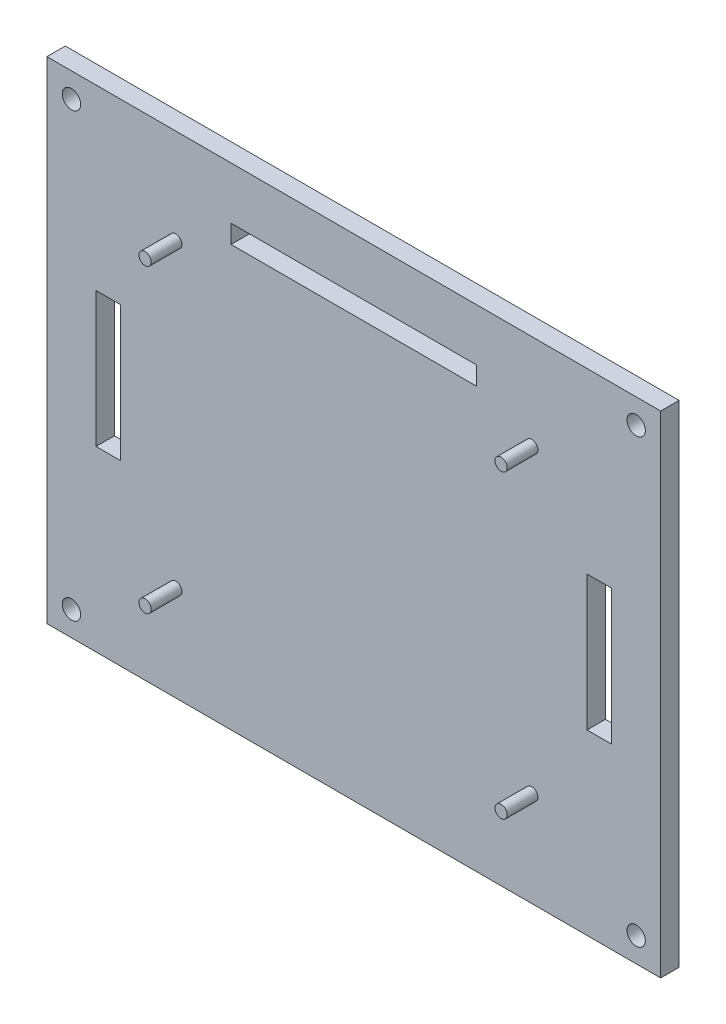
ISO-10303-21;
HEADER;
FILE_DESCRIPTION(('STEP AP214'),'2;1');
FILE_NAME('part.step','',(''),(''),'','','');
FILE_SCHEMA(('AUTOMOTIVE_DESIGN { 1 0 10303 214 1 1 1 1 }'));
ENDSEC;
DATA;
#1=APPLICATION_CONTEXT('core data for automotive mechanical design processes');
#2=APPLICATION_PROTOCOL_DEFINITION('international standard','automotive_design',2000,#1);
#3=PRODUCT_CONTEXT('',#1,'mechanical');
#4=PRODUCT('Part','Part','',(#3));
#5=PRODUCT_RELATED_PRODUCT_CATEGORY('part','',(#4));
#6=PRODUCT_DEFINITION_FORMATION('','',#4);
#7=PRODUCT_DEFINITION_CONTEXT('part definition',#1,'design');
#8=PRODUCT_DEFINITION('design','',#6,#7);
#9=PRODUCT_DEFINITION_SHAPE('','',#8);
#10=(LENGTH_UNIT() NAMED_UNIT(*) SI_UNIT(.MILLI.,.METRE.));
#11=(NAMED_UNIT(*) PLANE_ANGLE_UNIT() SI_UNIT($,.RADIAN.));
#12=(NAMED_UNIT(*) SI_UNIT($,.STERADIAN.) SOLID_ANGLE_UNIT());
#13=UNCERTAINTY_MEASURE_WITH_UNIT(LENGTH_MEASURE(1.E-05),#10,'distance_accuracy_value','');
#14=(GEOMETRIC_REPRESENTATION_CONTEXT(3) GLOBAL_UNCERTAINTY_ASSIGNED_CONTEXT((#13)) GLOBAL_UNIT_ASSIGNED_CONTEXT((#10,
#11,#12)) REPRESENTATION_CONTEXT('',''));
#15=CARTESIAN_POINT('',(0.,0.,0.));
#16=DIRECTION('',(0.,0.,1.));
#17=DIRECTION('',(1.,0.,0.));
#18=AXIS2_PLACEMENT_3D('',#15,#16,#17);
#19=CARTESIAN_POINT('',(0.,0.,3.));
#20=DIRECTION('',(0.,0.,1.));
#21=DIRECTION('',(1.,0.,0.));
#22=AXIS2_PLACEMENT_3D('',#19,#20,#21);
#23=PLANE('',#22);
#24=CARTESIAN_POINT('',(-28.9999999999995,-24.5,3.));
#25=DIRECTION('',(0.,0.,1.));
#26=DIRECTION('',(1.,0.,0.));
#27=AXIS2_PLACEMENT_3D('',#24,#25,#26);
#28=CIRCLE('',#27,1.);
#29=CARTESIAN_POINT('',(-27.9999999999995,-24.5,3.));
#30=VERTEX_POINT('',#29);
#31=EDGE_CURVE('E441',#30,#30,#28,.T.);
#32=ORIENTED_EDGE('',*,*,#31,.F.);
#33=EDGE_LOOP('',(#32));
#34=FACE_BOUND('',#33,.T.);
#35=CARTESIAN_POINT('',(29.0000000000005,-24.5,3.));
#36=DIRECTION('',(0.,0.,1.));
#37=DIRECTION('',(1.,0.,0.));
#38=AXIS2_PLACEMENT_3D('',#35,#36,#37);
#39=CIRCLE('',#38,1.);
#40=CARTESIAN_POINT('',(30.0000000000005,-24.5,3.));
#41=VERTEX_POINT('',#40);
#42=EDGE_CURVE('E440',#41,#41,#39,.T.);
#43=ORIENTED_EDGE('',*,*,#42,.F.);
#44=EDGE_LOOP('',(#43));
#45=FACE_BOUND('',#44,.T.);
#46=CARTESIAN_POINT('',(29.,24.5,3.));
#47=DIRECTION('',(0.,0.,1.));
#48=DIRECTION('',(1.,0.,0.));
#49=AXIS2_PLACEMENT_3D('',#46,#47,#48);
#50=CIRCLE('',#49,1.);
#51=CARTESIAN_POINT('',(30.,24.5,3.));
#52=VERTEX_POINT('',#51);
#53=EDGE_CURVE('E450',#52,#52,#50,.T.);
#54=ORIENTED_EDGE('',*,*,#53,.F.);
#55=EDGE_LOOP('',(#54));
#56=FACE_BOUND('',#55,.T.);
#57=CARTESIAN_POINT('',(-29.,24.5,3.));
#58=DIRECTION('',(0.,0.,1.));
#59=DIRECTION('',(1.,0.,0.));
#60=AXIS2_PLACEMENT_3D('',#57,#58,#59);
#61=CIRCLE('',#60,1.);
#62=CARTESIAN_POINT('',(-28.,24.5,3.));
#63=VERTEX_POINT('',#62);
#64=EDGE_CURVE('E455',#63,#63,#61,.T.);
#65=ORIENTED_EDGE('',*,*,#64,.F.);
#66=EDGE_LOOP('',(#65));
#67=FACE_BOUND('',#66,.T.);
#68=CARTESIAN_POINT('',(46.0000000000007,-36.,3.));
#69=DIRECTION('',(0.,0.,1.));
#70=DIRECTION('',(1.,0.,0.));
#71=AXIS2_PLACEMENT_3D('',#68,#69,#70);
#72=CIRCLE('',#71,1.5);
#73=CARTESIAN_POINT('',(47.5000000000007,-36.,3.));
#74=VERTEX_POINT('',#73);
#75=EDGE_CURVE('E221',#74,#74,#72,.T.);
#76=ORIENTED_EDGE('',*,*,#75,.F.);
#77=EDGE_LOOP('',(#76));
#78=FACE_BOUND('',#77,.T.);
#79=DIRECTION('',(1.,0.,0.));
#80=VECTOR('',#79,1.);
#81=CARTESIAN_POINT('',(-42.,-11.,3.));
#82=LINE('',#81,#80);
#83=CARTESIAN_POINT('',(-42.,-11.,3.));
#84=VERTEX_POINT('',#83);
#85=CARTESIAN_POINT('',(-38.,-11.,3.));
#86=VERTEX_POINT('',#85);
#87=EDGE_CURVE('E235',#84,#86,#82,.T.);
#88=ORIENTED_EDGE('',*,*,#87,.F.);
#89=DIRECTION('',(0.,-1.,0.));
#90=VECTOR('',#89,1.);
#91=CARTESIAN_POINT('',(-42.,-11.,3.));
#92=LINE('',#91,#90);
#93=CARTESIAN_POINT('',(-42.,11.,3.));
#94=VERTEX_POINT('',#93);
#95=EDGE_CURVE('E233',#94,#84,#92,.T.);
#96=ORIENTED_EDGE('',*,*,#95,.F.);
#97=DIRECTION('',(-1.,0.,0.));
#98=VECTOR('',#97,1.);
#99=CARTESIAN_POINT('',(-42.,11.,3.));
#100=LINE('',#99,#98);
#101=CARTESIAN_POINT('',(-38.,11.,3.));
#102=VERTEX_POINT('',#101);
#103=EDGE_CURVE('E241',#102,#94,#100,.T.);
#104=ORIENTED_EDGE('',*,*,#103,.F.);
#105=DIRECTION('',(0.,1.,0.));
#106=VECTOR('',#105,1.);
#107=CARTESIAN_POINT('',(-38.,-11.,3.));
#108=LINE('',#107,#106);
#109=EDGE_CURVE('E238',#86,#102,#108,.T.);
#110=ORIENTED_EDGE('',*,*,#109,.F.);
#111=EDGE_LOOP('',(#88,#96,#104,#110));
#112=FACE_BOUND('',#111,.T.);
#113=CARTESIAN_POINT('',(-46.,36.,3.));
#114=DIRECTION('',(0.,0.,1.));
#115=DIRECTION('',(1.,0.,0.));
#116=AXIS2_PLACEMENT_3D('',#113,#114,#115);
#117=CIRCLE('',#116,1.5);
#118=CARTESIAN_POINT('',(-44.5,36.,3.));
#119=VERTEX_POINT('',#118);
#120=EDGE_CURVE('E264',#119,#119,#117,.T.);
#121=ORIENTED_EDGE('',*,*,#120,.F.);
#122=EDGE_LOOP('',(#121));
#123=FACE_BOUND('',#122,.T.);
#124=DIRECTION('',(0.,-1.,0.));
#125=VECTOR('',#124,1.);
#126=CARTESIAN_POINT('',(-50.,-40.,3.));
#127=LINE('',#126,#125);
#128=CARTESIAN_POINT('',(-50.,40.,3.));
#129=VERTEX_POINT('',#128);
#130=CARTESIAN_POINT('',(-50.,-40.,3.));
#131=VERTEX_POINT('',#130);
#132=EDGE_CURVE('E270',#129,#131,#127,.T.);
#133=ORIENTED_EDGE('',*,*,#132,.T.);
#134=DIRECTION('',(1.,0.,0.));
#135=VECTOR('',#134,1.);
#136=CARTESIAN_POINT('',(50.,-40.,3.));
#137=LINE('',#136,#135);
#138=CARTESIAN_POINT('',(50.,-40.,3.));
#139=VERTEX_POINT('',#138);
#140=EDGE_CURVE('E273',#131,#139,#137,.T.);
#141=ORIENTED_EDGE('',*,*,#140,.T.);
#142=DIRECTION('',(0.,1.,0.));
#143=VECTOR('',#142,1.);
#144=CARTESIAN_POINT('',(50.,-40.,3.));
#145=LINE('',#144,#143);
#146=CARTESIAN_POINT('',(50.,40.,3.));
#147=VERTEX_POINT('',#146);
#148=EDGE_CURVE('E276',#139,#147,#145,.T.);
#149=ORIENTED_EDGE('',*,*,#148,.T.);
#150=DIRECTION('',(-1.,0.,0.));
#151=VECTOR('',#150,1.);
#152=CARTESIAN_POINT('',(50.,40.,3.));
#153=LINE('',#152,#151);
#154=EDGE_CURVE('E278',#147,#129,#153,.T.);
#155=ORIENTED_EDGE('',*,*,#154,.T.);
#156=EDGE_LOOP('',(#133,#141,#149,#155));
#157=FACE_BOUND('',#156,.T.);
#158=CARTESIAN_POINT('',(46.,36.,3.));
#159=DIRECTION('',(0.,0.,1.));
#160=DIRECTION('',(1.,0.,0.));
#161=AXIS2_PLACEMENT_3D('',#158,#159,#160);
#162=CIRCLE('',#161,1.5);
#163=CARTESIAN_POINT('',(47.5,36.,3.));
#164=VERTEX_POINT('',#163);
#165=EDGE_CURVE('E227',#164,#164,#162,.T.);
#166=ORIENTED_EDGE('',*,*,#165,.F.);
#167=EDGE_LOOP('',(#166));
#168=FACE_BOUND('',#167,.T.);
#169=CARTESIAN_POINT('',(-45.9999999999993,-36.,3.));
#170=DIRECTION('',(0.,0.,1.));
#171=DIRECTION('',(1.,0.,0.));
#172=AXIS2_PLACEMENT_3D('',#169,#170,#171);
#173=CIRCLE('',#172,1.5);
#174=CARTESIAN_POINT('',(-44.4999999999993,-36.,3.));
#175=VERTEX_POINT('',#174);
#176=EDGE_CURVE('E215',#175,#175,#173,.T.);
#177=ORIENTED_EDGE('',*,*,#176,.F.);
#178=EDGE_LOOP('',(#177));
#179=FACE_BOUND('',#178,.T.);
#180=DIRECTION('',(1.,0.,0.));
#181=VECTOR('',#180,1.);
#182=CARTESIAN_POINT('',(42.,-11.,3.));
#183=LINE('',#182,#181);
#184=CARTESIAN_POINT('',(38.,-11.,3.));
#185=VERTEX_POINT('',#184);
#186=CARTESIAN_POINT('',(42.,-11.,3.));
#187=VERTEX_POINT('',#186);
#188=EDGE_CURVE('E186',#185,#187,#183,.T.);
#189=ORIENTED_EDGE('',*,*,#188,.F.);
#190=DIRECTION('',(0.,-1.,0.));
#191=VECTOR('',#190,1.);
#192=CARTESIAN_POINT('',(38.,-11.,3.));
#193=LINE('',#192,#191);
#194=CARTESIAN_POINT('',(38.,11.,3.));
#195=VERTEX_POINT('',#194);
#196=EDGE_CURVE('E184',#195,#185,#193,.T.);
#197=ORIENTED_EDGE('',*,*,#196,.F.);
#198=DIRECTION('',(-1.,0.,0.));
#199=VECTOR('',#198,1.);
#200=CARTESIAN_POINT('',(42.,11.,3.));
#201=LINE('',#200,#199);
#202=CARTESIAN_POINT('',(42.,11.,3.));
#203=VERTEX_POINT('',#202);
#204=EDGE_CURVE('E192',#203,#195,#201,.T.);
#205=ORIENTED_EDGE('',*,*,#204,.F.);
#206=DIRECTION('',(0.,1.,0.));
#207=VECTOR('',#206,1.);
#208=CARTESIAN_POINT('',(42.,-11.,3.));
#209=LINE('',#208,#207);
#210=EDGE_CURVE('E189',#187,#203,#209,.T.);
#211=ORIENTED_EDGE('',*,*,#210,.F.);
#212=EDGE_LOOP('',(#189,#197,#205,#211));
#213=FACE_BOUND('',#212,.T.);
#214=DIRECTION('',(1.,0.,0.));
#215=VECTOR('',#214,1.);
#216=CARTESIAN_POINT('',(20.,28.5,3.));
#217=LINE('',#216,#215);
#218=CARTESIAN_POINT('',(-20.,28.5,3.));
#219=VERTEX_POINT('',#218);
#220=CARTESIAN_POINT('',(20.,28.5,3.));
#221=VERTEX_POINT('',#220);
#222=EDGE_CURVE('E154',#219,#221,#217,.T.);
#223=ORIENTED_EDGE('',*,*,#222,.F.);
#224=DIRECTION('',(0.,-1.,0.));
#225=VECTOR('',#224,1.);
#226=CARTESIAN_POINT('',(-20.,28.5,3.));
#227=LINE('',#226,#225);
#228=CARTESIAN_POINT('',(-20.,31.5,3.));
#229=VERTEX_POINT('',#228);
#230=EDGE_CURVE('E146',#229,#219,#227,.T.);
#231=ORIENTED_EDGE('',*,*,#230,.F.);
#232=DIRECTION('',(-1.,0.,0.));
#233=VECTOR('',#232,1.);
#234=CARTESIAN_POINT('',(20.,31.5,3.));
#235=LINE('',#234,#233);
#236=CARTESIAN_POINT('',(20.,31.5,3.));
#237=VERTEX_POINT('',#236);
#238=EDGE_CURVE('E168',#237,#229,#235,.T.);
#239=ORIENTED_EDGE('',*,*,#238,.F.);
#240=DIRECTION('',(0.,1.,0.));
#241=VECTOR('',#240,1.);
#242=CARTESIAN_POINT('',(20.,28.5,3.));
#243=LINE('',#242,#241);
#244=EDGE_CURVE('E166',#221,#237,#243,.T.);
#245=ORIENTED_EDGE('',*,*,#244,.F.);
#246=EDGE_LOOP('',(#223,#231,#239,#245));
#247=FACE_BOUND('',#246,.T.);
#248=ADVANCED_FACE('F33',(#34,#45,#56,#67,#78,#112,#123,#157,#168,#179,#213,#247),#23,.T.);
#249=CARTESIAN_POINT('',(0.,0.,0.));
#250=DIRECTION('',(0.,0.,1.));
#251=DIRECTION('',(1.,0.,0.));
#252=AXIS2_PLACEMENT_3D('',#249,#250,#251);
#253=PLANE('',#252);
#254=DIRECTION('',(0.,-1.,0.));
#255=VECTOR('',#254,1.);
#256=CARTESIAN_POINT('',(38.,-11.,0.));
#257=LINE('',#256,#255);
#258=CARTESIAN_POINT('',(38.,11.,0.));
#259=VERTEX_POINT('',#258);
#260=CARTESIAN_POINT('',(38.,-11.,0.));
#261=VERTEX_POINT('',#260);
#262=EDGE_CURVE('E162',#259,#261,#257,.T.);
#263=ORIENTED_EDGE('',*,*,#262,.T.);
#264=DIRECTION('',(1.,0.,0.));
#265=VECTOR('',#264,1.);
#266=CARTESIAN_POINT('',(42.,-11.,0.));
#267=LINE('',#266,#265);
#268=CARTESIAN_POINT('',(42.,-11.,0.));
#269=VERTEX_POINT('',#268);
#270=EDGE_CURVE('E197',#261,#269,#267,.T.);
#271=ORIENTED_EDGE('',*,*,#270,.T.);
#272=DIRECTION('',(0.,1.,0.));
#273=VECTOR('',#272,1.);
#274=CARTESIAN_POINT('',(42.,-11.,0.));
#275=LINE('',#274,#273);
#276=CARTESIAN_POINT('',(42.,11.,0.));
#277=VERTEX_POINT('',#276);
#278=EDGE_CURVE('E200',#269,#277,#275,.T.);
#279=ORIENTED_EDGE('',*,*,#278,.T.);
#280=DIRECTION('',(-1.,0.,0.));
#281=VECTOR('',#280,1.);
#282=CARTESIAN_POINT('',(42.,11.,0.));
#283=LINE('',#282,#281);
#284=EDGE_CURVE('E187',#277,#259,#283,.T.);
#285=ORIENTED_EDGE('',*,*,#284,.T.);
#286=EDGE_LOOP('',(#263,#271,#279,#285));
#287=FACE_BOUND('',#286,.T.);
#288=CARTESIAN_POINT('',(-46.,36.,0.));
#289=DIRECTION('',(0.,0.,1.));
#290=DIRECTION('',(1.,0.,0.));
#291=AXIS2_PLACEMENT_3D('',#288,#289,#290);
#292=CIRCLE('',#291,1.5);
#293=CARTESIAN_POINT('',(-44.5,36.,0.));
#294=VERTEX_POINT('',#293);
#295=EDGE_CURVE('E263',#294,#294,#292,.T.);
#296=ORIENTED_EDGE('',*,*,#295,.T.);
#297=EDGE_LOOP('',(#296));
#298=FACE_BOUND('',#297,.T.);
#299=DIRECTION('',(0.,-1.,0.));
#300=VECTOR('',#299,1.);
#301=CARTESIAN_POINT('',(-50.,-40.,0.));
#302=LINE('',#301,#300);
#303=CARTESIAN_POINT('',(-50.,40.,0.));
#304=VERTEX_POINT('',#303);
#305=CARTESIAN_POINT('',(-50.,-40.,0.));
#306=VERTEX_POINT('',#305);
#307=EDGE_CURVE('E267',#304,#306,#302,.T.);
#308=ORIENTED_EDGE('',*,*,#307,.F.);
#309=DIRECTION('',(-1.,0.,0.));
#310=VECTOR('',#309,1.);
#311=CARTESIAN_POINT('',(50.,40.,0.));
#312=LINE('',#311,#310);
#313=CARTESIAN_POINT('',(50.,40.,0.));
#314=VERTEX_POINT('',#313);
#315=EDGE_CURVE('E274',#314,#304,#312,.T.);
#316=ORIENTED_EDGE('',*,*,#315,.F.);
#317=DIRECTION('',(0.,1.,0.));
#318=VECTOR('',#317,1.);
#319=CARTESIAN_POINT('',(50.,-40.,0.));
#320=LINE('',#319,#318);
#321=CARTESIAN_POINT('',(50.,-40.,0.));
#322=VERTEX_POINT('',#321);
#323=EDGE_CURVE('E285',#322,#314,#320,.T.);
#324=ORIENTED_EDGE('',*,*,#323,.F.);
#325=DIRECTION('',(1.,0.,0.));
#326=VECTOR('',#325,1.);
#327=CARTESIAN_POINT('',(50.,-40.,0.));
#328=LINE('',#327,#326);
#329=EDGE_CURVE('E283',#306,#322,#328,.T.);
#330=ORIENTED_EDGE('',*,*,#329,.F.);
#331=EDGE_LOOP('',(#308,#316,#324,#330));
#332=FACE_BOUND('',#331,.T.);
#333=DIRECTION('',(0.,-1.,0.));
#334=VECTOR('',#333,1.);
#335=CARTESIAN_POINT('',(-42.,-11.,0.));
#336=LINE('',#335,#334);
#337=CARTESIAN_POINT('',(-42.,11.,0.));
#338=VERTEX_POINT('',#337);
#339=CARTESIAN_POINT('',(-42.,-11.,0.));
#340=VERTEX_POINT('',#339);
#341=EDGE_CURVE('E230',#338,#340,#336,.T.);
#342=ORIENTED_EDGE('',*,*,#341,.T.);
#343=DIRECTION('',(1.,0.,0.));
#344=VECTOR('',#343,1.);
#345=CARTESIAN_POINT('',(-42.,-11.,0.));
#346=LINE('',#345,#344);
#347=CARTESIAN_POINT('',(-38.,-11.,0.));
#348=VERTEX_POINT('',#347);
#349=EDGE_CURVE('E246',#340,#348,#346,.T.);
#350=ORIENTED_EDGE('',*,*,#349,.T.);
#351=DIRECTION('',(0.,1.,0.));
#352=VECTOR('',#351,1.);
#353=CARTESIAN_POINT('',(-38.,-11.,0.));
#354=LINE('',#353,#352);
#355=CARTESIAN_POINT('',(-38.,11.,0.));
#356=VERTEX_POINT('',#355);
#357=EDGE_CURVE('E249',#348,#356,#354,.T.);
#358=ORIENTED_EDGE('',*,*,#357,.T.);
#359=DIRECTION('',(-1.,0.,0.));
#360=VECTOR('',#359,1.);
#361=CARTESIAN_POINT('',(-42.,11.,0.));
#362=LINE('',#361,#360);
#363=EDGE_CURVE('E236',#356,#338,#362,.T.);
#364=ORIENTED_EDGE('',*,*,#363,.T.);
#365=EDGE_LOOP('',(#342,#350,#358,#364));
#366=FACE_BOUND('',#365,.T.);
#367=CARTESIAN_POINT('',(46.,36.,0.));
#368=DIRECTION('',(0.,0.,1.));
#369=DIRECTION('',(1.,0.,0.));
#370=AXIS2_PLACEMENT_3D('',#367,#368,#369);
#371=CIRCLE('',#370,1.5);
#372=CARTESIAN_POINT('',(47.5,36.,0.));
#373=VERTEX_POINT('',#372);
#374=EDGE_CURVE('E224',#373,#373,#371,.T.);
#375=ORIENTED_EDGE('',*,*,#374,.T.);
#376=EDGE_LOOP('',(#375));
#377=FACE_BOUND('',#376,.T.);
#378=CARTESIAN_POINT('',(46.0000000000007,-36.,0.));
#379=DIRECTION('',(0.,0.,1.));
#380=DIRECTION('',(1.,0.,0.));
#381=AXIS2_PLACEMENT_3D('',#378,#379,#380);
#382=CIRCLE('',#381,1.5);
#383=CARTESIAN_POINT('',(47.5000000000007,-36.,0.));
#384=VERTEX_POINT('',#383);
#385=EDGE_CURVE('E218',#384,#384,#382,.T.);
#386=ORIENTED_EDGE('',*,*,#385,.T.);
#387=EDGE_LOOP('',(#386));
#388=FACE_BOUND('',#387,.T.);
#389=CARTESIAN_POINT('',(-45.9999999999993,-36.,0.));
#390=DIRECTION('',(0.,0.,1.));
#391=DIRECTION('',(1.,0.,0.));
#392=AXIS2_PLACEMENT_3D('',#389,#390,#391);
#393=CIRCLE('',#392,1.5);
#394=CARTESIAN_POINT('',(-44.4999999999993,-36.,0.));
#395=VERTEX_POINT('',#394);
#396=EDGE_CURVE('E214',#395,#395,#393,.T.);
#397=ORIENTED_EDGE('',*,*,#396,.T.);
#398=EDGE_LOOP('',(#397));
#399=FACE_BOUND('',#398,.T.);
#400=DIRECTION('',(0.,-1.,0.));
#401=VECTOR('',#400,1.);
#402=CARTESIAN_POINT('',(-20.,28.5,0.));
#403=LINE('',#402,#401);
#404=CARTESIAN_POINT('',(-20.,31.5,0.));
#405=VERTEX_POINT('',#404);
#406=CARTESIAN_POINT('',(-20.,28.5,0.));
#407=VERTEX_POINT('',#406);
#408=EDGE_CURVE('E56',#405,#407,#403,.T.);
#409=ORIENTED_EDGE('',*,*,#408,.T.);
#410=DIRECTION('',(1.,0.,0.));
#411=VECTOR('',#410,1.);
#412=CARTESIAN_POINT('',(20.,28.5,0.));
#413=LINE('',#412,#411);
#414=CARTESIAN_POINT('',(20.,28.5,0.));
#415=VERTEX_POINT('',#414);
#416=EDGE_CURVE('E161',#407,#415,#413,.T.);
#417=ORIENTED_EDGE('',*,*,#416,.T.);
#418=DIRECTION('',(0.,1.,0.));
#419=VECTOR('',#418,1.);
#420=CARTESIAN_POINT('',(20.,28.5,0.));
#421=LINE('',#420,#419);
#422=CARTESIAN_POINT('',(20.,31.5,0.));
#423=VERTEX_POINT('',#422);
#424=EDGE_CURVE('E176',#415,#423,#421,.T.);
#425=ORIENTED_EDGE('',*,*,#424,.T.);
#426=DIRECTION('',(-1.,0.,0.));
#427=VECTOR('',#426,1.);
#428=CARTESIAN_POINT('',(20.,31.5,0.));
#429=LINE('',#428,#427);
#430=EDGE_CURVE('E155',#423,#405,#429,.T.);
#431=ORIENTED_EDGE('',*,*,#430,.T.);
#432=EDGE_LOOP('',(#409,#417,#425,#431));
#433=FACE_BOUND('',#432,.T.);
#434=ADVANCED_FACE('F303',(#287,#298,#332,#366,#377,#388,#399,#433),#253,.F.);
#435=CARTESIAN_POINT('',(-50.,-40.,3.));
#436=DIRECTION('',(1.,0.,0.));
#437=DIRECTION('',(0.,1.,0.));
#438=AXIS2_PLACEMENT_3D('',#435,#436,#437);
#439=PLANE('',#438);
#440=ORIENTED_EDGE('',*,*,#307,.T.);
#441=DIRECTION('',(0.,0.,-1.));
#442=VECTOR('',#441,1.);
#443=CARTESIAN_POINT('',(-50.,-40.,3.));
#444=LINE('',#443,#442);
#445=EDGE_CURVE('E11',#131,#306,#444,.T.);
#446=ORIENTED_EDGE('',*,*,#445,.F.);
#447=ORIENTED_EDGE('',*,*,#132,.F.);
#448=DIRECTION('',(0.,0.,-1.));
#449=VECTOR('',#448,1.);
#450=CARTESIAN_POINT('',(-50.,40.,3.));
#451=LINE('',#450,#449);
#452=EDGE_CURVE('E280',#129,#304,#451,.T.);
#453=ORIENTED_EDGE('',*,*,#452,.T.);
#454=EDGE_LOOP('',(#440,#446,#447,#453));
#455=FACE_BOUND('',#454,.T.);
#456=ADVANCED_FACE('F35',(#455),#439,.F.);
#457=CARTESIAN_POINT('',(50.,-40.,3.));
#458=DIRECTION('',(0.,1.,0.));
#459=DIRECTION('',(-1.,0.,0.));
#460=AXIS2_PLACEMENT_3D('',#457,#458,#459);
#461=PLANE('',#460);
#462=ORIENTED_EDGE('',*,*,#329,.T.);
#463=DIRECTION('',(0.,0.,-1.));
#464=VECTOR('',#463,1.);
#465=CARTESIAN_POINT('',(50.,-40.,3.));
#466=LINE('',#465,#464);
#467=EDGE_CURVE('E41',#139,#322,#466,.T.);
#468=ORIENTED_EDGE('',*,*,#467,.F.);
#469=ORIENTED_EDGE('',*,*,#140,.F.);
#470=ORIENTED_EDGE('',*,*,#445,.T.);
#471=EDGE_LOOP('',(#462,#468,#469,#470));
#472=FACE_BOUND('',#471,.T.);
#473=ADVANCED_FACE('F314',(#472),#461,.F.);
#474=CARTESIAN_POINT('',(50.,-40.,3.));
#475=DIRECTION('',(-1.,0.,0.));
#476=DIRECTION('',(0.,0.,1.));
#477=AXIS2_PLACEMENT_3D('',#474,#475,#476);
#478=PLANE('',#477);
#479=ORIENTED_EDGE('',*,*,#323,.T.);
#480=DIRECTION('',(0.,0.,-1.));
#481=VECTOR('',#480,1.);
#482=CARTESIAN_POINT('',(50.,40.,3.));
#483=LINE('',#482,#481);
#484=EDGE_CURVE('E290',#147,#314,#483,.T.);
#485=ORIENTED_EDGE('',*,*,#484,.F.);
#486=ORIENTED_EDGE('',*,*,#148,.F.);
#487=ORIENTED_EDGE('',*,*,#467,.T.);
#488=EDGE_LOOP('',(#479,#485,#486,#487));
#489=FACE_BOUND('',#488,.T.);
#490=ADVANCED_FACE('F297',(#489),#478,.F.);
#491=CARTESIAN_POINT('',(50.,40.,3.));
#492=DIRECTION('',(0.,-1.,0.));
#493=DIRECTION('',(0.,0.,-1.));
#494=AXIS2_PLACEMENT_3D('',#491,#492,#493);
#495=PLANE('',#494);
#496=ORIENTED_EDGE('',*,*,#315,.T.);
#497=ORIENTED_EDGE('',*,*,#452,.F.);
#498=ORIENTED_EDGE('',*,*,#154,.F.);
#499=ORIENTED_EDGE('',*,*,#484,.T.);
#500=EDGE_LOOP('',(#496,#497,#498,#499));
#501=FACE_BOUND('',#500,.T.);
#502=ADVANCED_FACE('F307',(#501),#495,.F.);
#503=CARTESIAN_POINT('',(-46.,36.,3.));
#504=DIRECTION('',(0.,0.,-1.));
#505=DIRECTION('',(-1.,0.,0.));
#506=AXIS2_PLACEMENT_3D('',#503,#504,#505);
#507=CYLINDRICAL_SURFACE('',#506,1.5);
#508=ORIENTED_EDGE('',*,*,#120,.T.);
#509=EDGE_LOOP('',(#508));
#510=FACE_BOUND('',#509,.T.);
#511=ORIENTED_EDGE('',*,*,#295,.F.);
#512=EDGE_LOOP('',(#511));
#513=FACE_BOUND('',#512,.T.);
#514=ADVANCED_FACE('F332',(#510,#513),#507,.F.);
#515=CARTESIAN_POINT('',(-42.,-11.,3.));
#516=DIRECTION('',(1.,0.,0.));
#517=DIRECTION('',(0.,0.,-1.));
#518=AXIS2_PLACEMENT_3D('',#515,#516,#517);
#519=PLANE('',#518);
#520=ORIENTED_EDGE('',*,*,#341,.F.);
#521=DIRECTION('',(0.,0.,-1.));
#522=VECTOR('',#521,1.);
#523=CARTESIAN_POINT('',(-42.,11.,3.));
#524=LINE('',#523,#522);
#525=EDGE_CURVE('E243',#94,#338,#524,.T.);
#526=ORIENTED_EDGE('',*,*,#525,.F.);
#527=ORIENTED_EDGE('',*,*,#95,.T.);
#528=DIRECTION('',(0.,0.,-1.));
#529=VECTOR('',#528,1.);
#530=CARTESIAN_POINT('',(-42.,-11.,3.));
#531=LINE('',#530,#529);
#532=EDGE_CURVE('E260',#84,#340,#531,.T.);
#533=ORIENTED_EDGE('',*,*,#532,.T.);
#534=EDGE_LOOP('',(#520,#526,#527,#533));
#535=FACE_BOUND('',#534,.T.);
#536=ADVANCED_FACE('F339',(#535),#519,.T.);
#537=CARTESIAN_POINT('',(-42.,-11.,3.));
#538=DIRECTION('',(0.,1.,0.));
#539=DIRECTION('',(0.,0.,1.));
#540=AXIS2_PLACEMENT_3D('',#537,#538,#539);
#541=PLANE('',#540);
#542=ORIENTED_EDGE('',*,*,#349,.F.);
#543=ORIENTED_EDGE('',*,*,#532,.F.);
#544=ORIENTED_EDGE('',*,*,#87,.T.);
#545=DIRECTION('',(0.,0.,-1.));
#546=VECTOR('',#545,1.);
#547=CARTESIAN_POINT('',(-38.,-11.,3.));
#548=LINE('',#547,#546);
#549=EDGE_CURVE('E258',#86,#348,#548,.T.);
#550=ORIENTED_EDGE('',*,*,#549,.T.);
#551=EDGE_LOOP('',(#542,#543,#544,#550));
#552=FACE_BOUND('',#551,.T.);
#553=ADVANCED_FACE('F344',(#552),#541,.T.);
#554=CARTESIAN_POINT('',(-38.,-11.,3.));
#555=DIRECTION('',(-1.,0.,0.));
#556=DIRECTION('',(0.,0.,1.));
#557=AXIS2_PLACEMENT_3D('',#554,#555,#556);
#558=PLANE('',#557);
#559=ORIENTED_EDGE('',*,*,#357,.F.);
#560=ORIENTED_EDGE('',*,*,#549,.F.);
#561=ORIENTED_EDGE('',*,*,#109,.T.);
#562=DIRECTION('',(0.,0.,-1.));
#563=VECTOR('',#562,1.);
#564=CARTESIAN_POINT('',(-38.,11.,3.));
#565=LINE('',#564,#563);
#566=EDGE_CURVE('E256',#102,#356,#565,.T.);
#567=ORIENTED_EDGE('',*,*,#566,.T.);
#568=EDGE_LOOP('',(#559,#560,#561,#567));
#569=FACE_BOUND('',#568,.T.);
#570=ADVANCED_FACE('F354',(#569),#558,.T.);
#571=CARTESIAN_POINT('',(-42.,11.,3.));
#572=DIRECTION('',(0.,-1.,0.));
#573=DIRECTION('',(0.,0.,-1.));
#574=AXIS2_PLACEMENT_3D('',#571,#572,#573);
#575=PLANE('',#574);
#576=ORIENTED_EDGE('',*,*,#363,.F.);
#577=ORIENTED_EDGE('',*,*,#566,.F.);
#578=ORIENTED_EDGE('',*,*,#103,.T.);
#579=ORIENTED_EDGE('',*,*,#525,.T.);
#580=EDGE_LOOP('',(#576,#577,#578,#579));
#581=FACE_BOUND('',#580,.T.);
#582=ADVANCED_FACE('F360',(#581),#575,.T.);
#583=CARTESIAN_POINT('',(46.,36.,3.));
#584=DIRECTION('',(0.,0.,-1.));
#585=DIRECTION('',(-1.,0.,0.));
#586=AXIS2_PLACEMENT_3D('',#583,#584,#585);
#587=CYLINDRICAL_SURFACE('',#586,1.5);
#588=ORIENTED_EDGE('',*,*,#165,.T.);
#589=EDGE_LOOP('',(#588));
#590=FACE_BOUND('',#589,.T.);
#591=ORIENTED_EDGE('',*,*,#374,.F.);
#592=EDGE_LOOP('',(#591));
#593=FACE_BOUND('',#592,.T.);
#594=ADVANCED_FACE('F364',(#590,#593),#587,.F.);
#595=CARTESIAN_POINT('',(46.0000000000007,-36.,3.));
#596=DIRECTION('',(0.,0.,-1.));
#597=DIRECTION('',(-1.,0.,0.));
#598=AXIS2_PLACEMENT_3D('',#595,#596,#597);
#599=CYLINDRICAL_SURFACE('',#598,1.5);
#600=ORIENTED_EDGE('',*,*,#75,.T.);
#601=EDGE_LOOP('',(#600));
#602=FACE_BOUND('',#601,.T.);
#603=ORIENTED_EDGE('',*,*,#385,.F.);
#604=EDGE_LOOP('',(#603));
#605=FACE_BOUND('',#604,.T.);
#606=ADVANCED_FACE('F368',(#602,#605),#599,.F.);
#607=CARTESIAN_POINT('',(-45.9999999999993,-36.,3.));
#608=DIRECTION('',(0.,0.,-1.));
#609=DIRECTION('',(-1.,0.,0.));
#610=AXIS2_PLACEMENT_3D('',#607,#608,#609);
#611=CYLINDRICAL_SURFACE('',#610,1.5);
#612=ORIENTED_EDGE('',*,*,#176,.T.);
#613=EDGE_LOOP('',(#612));
#614=FACE_BOUND('',#613,.T.);
#615=ORIENTED_EDGE('',*,*,#396,.F.);
#616=EDGE_LOOP('',(#615));
#617=FACE_BOUND('',#616,.T.);
#618=ADVANCED_FACE('F372',(#614,#617),#611,.F.);
#619=CARTESIAN_POINT('',(38.,-11.,3.));
#620=DIRECTION('',(1.,0.,0.));
#621=DIRECTION('',(0.,0.,-1.));
#622=AXIS2_PLACEMENT_3D('',#619,#620,#621);
#623=PLANE('',#622);
#624=ORIENTED_EDGE('',*,*,#262,.F.);
#625=DIRECTION('',(0.,0.,-1.));
#626=VECTOR('',#625,1.);
#627=CARTESIAN_POINT('',(38.,11.,3.));
#628=LINE('',#627,#626);
#629=EDGE_CURVE('E194',#195,#259,#628,.T.);
#630=ORIENTED_EDGE('',*,*,#629,.F.);
#631=ORIENTED_EDGE('',*,*,#196,.T.);
#632=DIRECTION('',(0.,0.,-1.));
#633=VECTOR('',#632,1.);
#634=CARTESIAN_POINT('',(38.,-11.,3.));
#635=LINE('',#634,#633);
#636=EDGE_CURVE('E211',#185,#261,#635,.T.);
#637=ORIENTED_EDGE('',*,*,#636,.T.);
#638=EDGE_LOOP('',(#624,#630,#631,#637));
#639=FACE_BOUND('',#638,.T.);
#640=ADVANCED_FACE('F376',(#639),#623,.T.);
#641=CARTESIAN_POINT('',(42.,-11.,3.));
#642=DIRECTION('',(0.,1.,0.));
#643=DIRECTION('',(0.,0.,1.));
#644=AXIS2_PLACEMENT_3D('',#641,#642,#643);
#645=PLANE('',#644);
#646=ORIENTED_EDGE('',*,*,#270,.F.);
#647=ORIENTED_EDGE('',*,*,#636,.F.);
#648=ORIENTED_EDGE('',*,*,#188,.T.);
#649=DIRECTION('',(0.,0.,-1.));
#650=VECTOR('',#649,1.);
#651=CARTESIAN_POINT('',(42.,-11.,3.));
#652=LINE('',#651,#650);
#653=EDGE_CURVE('E209',#187,#269,#652,.T.);
#654=ORIENTED_EDGE('',*,*,#653,.T.);
#655=EDGE_LOOP('',(#646,#647,#648,#654));
#656=FACE_BOUND('',#655,.T.);
#657=ADVANCED_FACE('F380',(#656),#645,.T.);
#658=CARTESIAN_POINT('',(42.,-11.,3.));
#659=DIRECTION('',(-1.,0.,0.));
#660=DIRECTION('',(0.,0.,1.));
#661=AXIS2_PLACEMENT_3D('',#658,#659,#660);
#662=PLANE('',#661);
#663=ORIENTED_EDGE('',*,*,#278,.F.);
#664=ORIENTED_EDGE('',*,*,#653,.F.);
#665=ORIENTED_EDGE('',*,*,#210,.T.);
#666=DIRECTION('',(0.,0.,-1.));
#667=VECTOR('',#666,1.);
#668=CARTESIAN_POINT('',(42.,11.,3.));
#669=LINE('',#668,#667);
#670=EDGE_CURVE('E207',#203,#277,#669,.T.);
#671=ORIENTED_EDGE('',*,*,#670,.T.);
#672=EDGE_LOOP('',(#663,#664,#665,#671));
#673=FACE_BOUND('',#672,.T.);
#674=ADVANCED_FACE('F384',(#673),#662,.T.);
#675=CARTESIAN_POINT('',(42.,11.,3.));
#676=DIRECTION('',(0.,-1.,0.));
#677=DIRECTION('',(0.,0.,-1.));
#678=AXIS2_PLACEMENT_3D('',#675,#676,#677);
#679=PLANE('',#678);
#680=ORIENTED_EDGE('',*,*,#284,.F.);
#681=ORIENTED_EDGE('',*,*,#670,.F.);
#682=ORIENTED_EDGE('',*,*,#204,.T.);
#683=ORIENTED_EDGE('',*,*,#629,.T.);
#684=EDGE_LOOP('',(#680,#681,#682,#683));
#685=FACE_BOUND('',#684,.T.);
#686=ADVANCED_FACE('F388',(#685),#679,.T.);
#687=CARTESIAN_POINT('',(-20.,28.5,3.));
#688=DIRECTION('',(1.,0.,0.));
#689=DIRECTION('',(0.,1.,0.));
#690=AXIS2_PLACEMENT_3D('',#687,#688,#689);
#691=PLANE('',#690);
#692=ORIENTED_EDGE('',*,*,#408,.F.);
#693=DIRECTION('',(0.,0.,-1.));
#694=VECTOR('',#693,1.);
#695=CARTESIAN_POINT('',(-20.,31.5,3.));
#696=LINE('',#695,#694);
#697=EDGE_CURVE('E150',#229,#405,#696,.T.);
#698=ORIENTED_EDGE('',*,*,#697,.F.);
#699=ORIENTED_EDGE('',*,*,#230,.T.);
#700=DIRECTION('',(0.,0.,-1.));
#701=VECTOR('',#700,1.);
#702=CARTESIAN_POINT('',(-20.,28.5,3.));
#703=LINE('',#702,#701);
#704=EDGE_CURVE('E149',#219,#407,#703,.T.);
#705=ORIENTED_EDGE('',*,*,#704,.T.);
#706=EDGE_LOOP('',(#692,#698,#699,#705));
#707=FACE_BOUND('',#706,.T.);
#708=ADVANCED_FACE('F148',(#707),#691,.T.);
#709=CARTESIAN_POINT('',(20.,28.5,3.));
#710=DIRECTION('',(0.,1.,0.));
#711=DIRECTION('',(-1.,0.,0.));
#712=AXIS2_PLACEMENT_3D('',#709,#710,#711);
#713=PLANE('',#712);
#714=ORIENTED_EDGE('',*,*,#416,.F.);
#715=ORIENTED_EDGE('',*,*,#704,.F.);
#716=ORIENTED_EDGE('',*,*,#222,.T.);
#717=DIRECTION('',(0.,0.,-1.));
#718=VECTOR('',#717,1.);
#719=CARTESIAN_POINT('',(20.,28.5,3.));
#720=LINE('',#719,#718);
#721=EDGE_CURVE('E163',#221,#415,#720,.T.);
#722=ORIENTED_EDGE('',*,*,#721,.T.);
#723=EDGE_LOOP('',(#714,#715,#716,#722));
#724=FACE_BOUND('',#723,.T.);
#725=ADVANCED_FACE('F158',(#724),#713,.T.);
#726=CARTESIAN_POINT('',(20.,28.5,3.));
#727=DIRECTION('',(-1.,0.,0.));
#728=DIRECTION('',(0.,-1.,0.));
#729=AXIS2_PLACEMENT_3D('',#726,#727,#728);
#730=PLANE('',#729);
#731=ORIENTED_EDGE('',*,*,#424,.F.);
#732=ORIENTED_EDGE('',*,*,#721,.F.);
#733=ORIENTED_EDGE('',*,*,#244,.T.);
#734=DIRECTION('',(0.,0.,-1.));
#735=VECTOR('',#734,1.);
#736=CARTESIAN_POINT('',(20.,31.5,3.));
#737=LINE('',#736,#735);
#738=EDGE_CURVE('E48',#237,#423,#737,.T.);
#739=ORIENTED_EDGE('',*,*,#738,.T.);
#740=EDGE_LOOP('',(#731,#732,#733,#739));
#741=FACE_BOUND('',#740,.T.);
#742=ADVANCED_FACE('F397',(#741),#730,.T.);
#743=CARTESIAN_POINT('',(20.,31.5,3.));
#744=DIRECTION('',(0.,-1.,0.));
#745=DIRECTION('',(1.,0.,0.));
#746=AXIS2_PLACEMENT_3D('',#743,#744,#745);
#747=PLANE('',#746);
#748=ORIENTED_EDGE('',*,*,#430,.F.);
#749=ORIENTED_EDGE('',*,*,#738,.F.);
#750=ORIENTED_EDGE('',*,*,#238,.T.);
#751=ORIENTED_EDGE('',*,*,#697,.T.);
#752=EDGE_LOOP('',(#748,#749,#750,#751));
#753=FACE_BOUND('',#752,.T.);
#754=ADVANCED_FACE('F400',(#753),#747,.T.);
#755=CARTESIAN_POINT('',(-29.,24.5,8.));
#756=DIRECTION('',(0.,0.,-1.));
#757=DIRECTION('',(-1.,0.,0.));
#758=AXIS2_PLACEMENT_3D('',#755,#756,#757);
#759=CYLINDRICAL_SURFACE('',#758,1.);
#760=CARTESIAN_POINT('',(-29.,24.5,8.));
#761=DIRECTION('',(0.,0.,1.));
#762=DIRECTION('',(1.,0.,0.));
#763=AXIS2_PLACEMENT_3D('',#760,#761,#762);
#764=CIRCLE('',#763,1.);
#765=CARTESIAN_POINT('',(-28.,24.5,8.));
#766=VERTEX_POINT('',#765);
#767=EDGE_CURVE('E174',#766,#766,#764,.T.);
#768=ORIENTED_EDGE('',*,*,#767,.F.);
#769=EDGE_LOOP('',(#768));
#770=FACE_BOUND('',#769,.T.);
#771=ORIENTED_EDGE('',*,*,#64,.T.);
#772=EDGE_LOOP('',(#771));
#773=FACE_BOUND('',#772,.T.);
#774=ADVANCED_FACE('F404',(#770,#773),#759,.T.);
#775=CARTESIAN_POINT('',(-29.,24.5,8.));
#776=DIRECTION('',(0.,0.,1.));
#777=DIRECTION('',(1.,0.,0.));
#778=AXIS2_PLACEMENT_3D('',#775,#776,#777);
#779=PLANE('',#778);
#780=ORIENTED_EDGE('',*,*,#767,.T.);
#781=EDGE_LOOP('',(#780));
#782=FACE_BOUND('',#781,.T.);
#783=ADVANCED_FACE('F407',(#782),#779,.T.);
#784=CARTESIAN_POINT('',(29.,24.5,8.));
#785=DIRECTION('',(0.,0.,-1.));
#786=DIRECTION('',(-1.,0.,0.));
#787=AXIS2_PLACEMENT_3D('',#784,#785,#786);
#788=CYLINDRICAL_SURFACE('',#787,1.);
#789=CARTESIAN_POINT('',(29.,24.5,8.));
#790=DIRECTION('',(0.,0.,1.));
#791=DIRECTION('',(1.,0.,0.));
#792=AXIS2_PLACEMENT_3D('',#789,#790,#791);
#793=CIRCLE('',#792,1.);
#794=CARTESIAN_POINT('',(30.,24.5,8.));
#795=VERTEX_POINT('',#794);
#796=EDGE_CURVE('E452',#795,#795,#793,.T.);
#797=ORIENTED_EDGE('',*,*,#796,.F.);
#798=EDGE_LOOP('',(#797));
#799=FACE_BOUND('',#798,.T.);
#800=ORIENTED_EDGE('',*,*,#53,.T.);
#801=EDGE_LOOP('',(#800));
#802=FACE_BOUND('',#801,.T.);
#803=ADVANCED_FACE('F411',(#799,#802),#788,.T.);
#804=CARTESIAN_POINT('',(29.,24.5,8.));
#805=DIRECTION('',(0.,0.,1.));
#806=DIRECTION('',(1.,0.,0.));
#807=AXIS2_PLACEMENT_3D('',#804,#805,#806);
#808=PLANE('',#807);
#809=ORIENTED_EDGE('',*,*,#796,.T.);
#810=EDGE_LOOP('',(#809));
#811=FACE_BOUND('',#810,.T.);
#812=ADVANCED_FACE('F415',(#811),#808,.T.);
#813=CARTESIAN_POINT('',(29.0000000000005,-24.5,8.));
#814=DIRECTION('',(0.,0.,-1.));
#815=DIRECTION('',(-1.,0.,0.));
#816=AXIS2_PLACEMENT_3D('',#813,#814,#815);
#817=CYLINDRICAL_SURFACE('',#816,1.);
#818=CARTESIAN_POINT('',(29.0000000000005,-24.5,8.));
#819=DIRECTION('',(0.,0.,1.));
#820=DIRECTION('',(1.,0.,0.));
#821=AXIS2_PLACEMENT_3D('',#818,#819,#820);
#822=CIRCLE('',#821,1.);
#823=CARTESIAN_POINT('',(30.0000000000005,-24.5,8.));
#824=VERTEX_POINT('',#823);
#825=EDGE_CURVE('E444',#824,#824,#822,.T.);
#826=ORIENTED_EDGE('',*,*,#825,.F.);
#827=EDGE_LOOP('',(#826));
#828=FACE_BOUND('',#827,.T.);
#829=ORIENTED_EDGE('',*,*,#42,.T.);
#830=EDGE_LOOP('',(#829));
#831=FACE_BOUND('',#830,.T.);
#832=ADVANCED_FACE('F419',(#828,#831),#817,.T.);
#833=CARTESIAN_POINT('',(29.0000000000005,-24.5,8.));
#834=DIRECTION('',(0.,0.,1.));
#835=DIRECTION('',(1.,0.,0.));
#836=AXIS2_PLACEMENT_3D('',#833,#834,#835);
#837=PLANE('',#836);
#838=ORIENTED_EDGE('',*,*,#825,.T.);
#839=EDGE_LOOP('',(#838));
#840=FACE_BOUND('',#839,.T.);
#841=ADVANCED_FACE('F423',(#840),#837,.T.);
#842=CARTESIAN_POINT('',(-28.9999999999995,-24.5,8.));
#843=DIRECTION('',(0.,0.,-1.));
#844=DIRECTION('',(-1.,0.,0.));
#845=AXIS2_PLACEMENT_3D('',#842,#843,#844);
#846=CYLINDRICAL_SURFACE('',#845,1.);
#847=CARTESIAN_POINT('',(-28.9999999999995,-24.5,8.));
#848=DIRECTION('',(0.,0.,1.));
#849=DIRECTION('',(1.,0.,0.));
#850=AXIS2_PLACEMENT_3D('',#847,#848,#849);
#851=CIRCLE('',#850,1.);
#852=CARTESIAN_POINT('',(-27.9999999999995,-24.5,8.));
#853=VERTEX_POINT('',#852);
#854=EDGE_CURVE('E439',#853,#853,#851,.T.);
#855=ORIENTED_EDGE('',*,*,#854,.F.);
#856=EDGE_LOOP('',(#855));
#857=FACE_BOUND('',#856,.T.);
#858=ORIENTED_EDGE('',*,*,#31,.T.);
#859=EDGE_LOOP('',(#858));
#860=FACE_BOUND('',#859,.T.);
#861=ADVANCED_FACE('F427',(#857,#860),#846,.T.);
#862=CARTESIAN_POINT('',(-28.9999999999995,-24.5,8.));
#863=DIRECTION('',(0.,0.,1.));
#864=DIRECTION('',(1.,0.,0.));
#865=AXIS2_PLACEMENT_3D('',#862,#863,#864);
#866=PLANE('',#865);
#867=ORIENTED_EDGE('',*,*,#854,.T.);
#868=EDGE_LOOP('',(#867));
#869=FACE_BOUND('',#868,.T.);
#870=ADVANCED_FACE('F431',(#869),#866,.T.);
#871=CLOSED_SHELL('',(#248,#434,#456,#473,#490,#502,#514,#536,#553,#570,#582,#594,#606,#618,
#640,#657,#674,#686,#708,#725,#742,#754,#774,#783,#803,#812,#832,#841,#861,#870));
#872=MANIFOLD_SOLID_BREP('B2',#871);
#873=ADVANCED_BREP_SHAPE_REPRESENTATION('',(#18,#872),#14);
#874=SHAPE_DEFINITION_REPRESENTATION(#9,#873);
ENDSEC;
END-ISO-10303-21;
